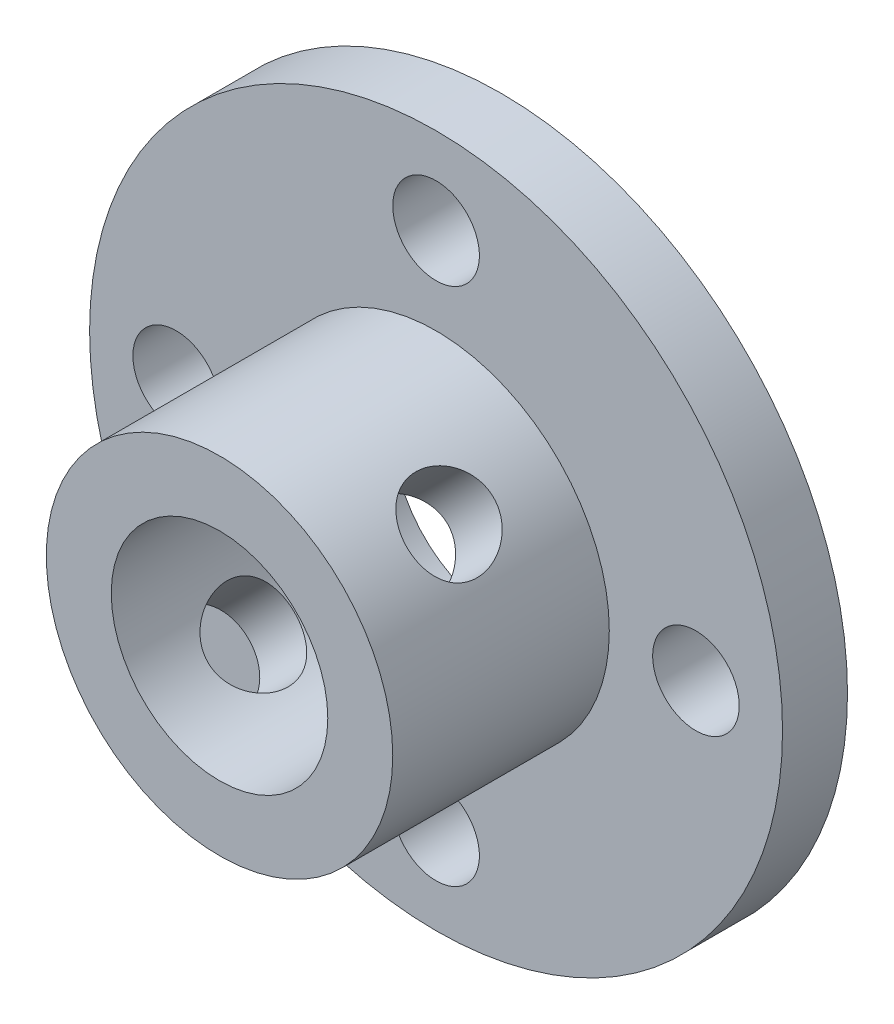
ISO-10303-21;
HEADER;
FILE_DESCRIPTION(('STEP AP214'),'2;1');
FILE_NAME('part.step','',(''),(''),'','','');
FILE_SCHEMA(('AUTOMOTIVE_DESIGN { 1 0 10303 214 1 1 1 1 }'));
ENDSEC;
DATA;
#1=APPLICATION_CONTEXT('core data for automotive mechanical design processes');
#2=APPLICATION_PROTOCOL_DEFINITION('international standard','automotive_design',2000,#1);
#3=PRODUCT_CONTEXT('',#1,'mechanical');
#4=PRODUCT('Part','Part','',(#3));
#5=PRODUCT_RELATED_PRODUCT_CATEGORY('part','',(#4));
#6=PRODUCT_DEFINITION_FORMATION('','',#4);
#7=PRODUCT_DEFINITION_CONTEXT('part definition',#1,'design');
#8=PRODUCT_DEFINITION('design','',#6,#7);
#9=PRODUCT_DEFINITION_SHAPE('','',#8);
#10=(LENGTH_UNIT() NAMED_UNIT(*) SI_UNIT(.MILLI.,.METRE.));
#11=(NAMED_UNIT(*) PLANE_ANGLE_UNIT() SI_UNIT($,.RADIAN.));
#12=(NAMED_UNIT(*) SI_UNIT($,.STERADIAN.) SOLID_ANGLE_UNIT());
#13=UNCERTAINTY_MEASURE_WITH_UNIT(LENGTH_MEASURE(1.E-05),#10,'distance_accuracy_value','');
#14=(GEOMETRIC_REPRESENTATION_CONTEXT(3) GLOBAL_UNCERTAINTY_ASSIGNED_CONTEXT((#13)) GLOBAL_UNIT_ASSIGNED_CONTEXT((#10,
#11,#12)) REPRESENTATION_CONTEXT('',''));
#15=CARTESIAN_POINT('',(0.,0.,0.));
#16=DIRECTION('',(0.,0.,1.));
#17=DIRECTION('',(1.,0.,0.));
#18=AXIS2_PLACEMENT_3D('',#15,#16,#17);
#19=CARTESIAN_POINT('',(0.,0.,10.));
#20=DIRECTION('',(0.,0.,-1.));
#21=DIRECTION('',(-1.,0.,0.));
#22=AXIS2_PLACEMENT_3D('',#19,#20,#21);
#23=CYLINDRICAL_SURFACE('',#22,8.);
#24=CARTESIAN_POINT('',(0.,0.,10.));
#25=DIRECTION('',(0.,0.,1.));
#26=DIRECTION('',(1.,0.,0.));
#27=AXIS2_PLACEMENT_3D('',#24,#25,#26);
#28=CIRCLE('',#27,8.);
#29=CARTESIAN_POINT('',(8.,0.,10.));
#30=VERTEX_POINT('',#29);
#31=EDGE_CURVE('E10',#30,#30,#28,.T.);
#32=ORIENTED_EDGE('',*,*,#31,.F.);
#33=EDGE_LOOP('',(#32));
#34=FACE_BOUND('',#33,.T.);
#35=CARTESIAN_POINT('',(0.,0.,0.));
#36=DIRECTION('',(0.,0.,1.));
#37=DIRECTION('',(1.,0.,0.));
#38=AXIS2_PLACEMENT_3D('',#35,#36,#37);
#39=CIRCLE('',#38,8.);
#40=CARTESIAN_POINT('',(8.,0.,0.));
#41=VERTEX_POINT('',#40);
#42=EDGE_CURVE('E51',#41,#41,#39,.T.);
#43=ORIENTED_EDGE('',*,*,#42,.T.);
#44=EDGE_LOOP('',(#43));
#45=FACE_BOUND('',#44,.T.);
#46=CARTESIAN_POINT('',(-4.06301201267858,-6.89143913742475,5.));
#47=CARTESIAN_POINT('',(-4.0630157217461,-6.89143840992678,5.11044060074126));
#48=CARTESIAN_POINT('',(-4.07119094661866,-6.88663699998199,5.22091591894282));
#49=CARTESIAN_POINT('',(-4.10347952386452,-6.8674446736421,5.43869406253881));
#50=CARTESIAN_POINT('',(-4.12760215209942,-6.85304817619185,5.54599500357455));
#51=CARTESIAN_POINT('',(-4.19053882294767,-6.81474355280739,5.75424283054975));
#52=CARTESIAN_POINT('',(-4.22933389862524,-6.79084770456586,5.85519772430857));
#53=CARTESIAN_POINT('',(-4.31983456089164,-6.73363818775688,6.04824868203191));
#54=CARTESIAN_POINT('',(-4.37154069559713,-6.70032411934725,6.14034436966417));
#55=CARTESIAN_POINT('',(-4.48684637018174,-6.62367602879998,6.31508931620977));
#56=CARTESIAN_POINT('',(-4.55066154225101,-6.58015630647196,6.39751488028004));
#57=CARTESIAN_POINT('',(-4.68695643232218,-6.48377932397724,6.54860911548827));
#58=CARTESIAN_POINT('',(-4.75943695936014,-6.4309211917146,6.6172765004974));
#59=CARTESIAN_POINT('',(-4.9114273459846,-6.31562284697669,6.73982037410502));
#60=CARTESIAN_POINT('',(-4.99102117674822,-6.25305922347522,6.79347711052917));
#61=CARTESIAN_POINT('',(-5.15341964034351,-6.11990810519378,6.88304771532247));
#62=CARTESIAN_POINT('',(-5.23622379749715,-6.0493217961739,6.91896420153241));
#63=CARTESIAN_POINT('',(-5.40042272750263,-5.90315727405414,6.97131826766287));
#64=CARTESIAN_POINT('',(-5.48181206953389,-5.82770915629177,6.98813571546127));
#65=CARTESIAN_POINT('',(-5.64220702569044,-5.67256036974151,7.00300670342044));
#66=CARTESIAN_POINT('',(-5.72121299050981,-5.59286033141329,7.00106301776768));
#67=CARTESIAN_POINT('',(-5.87281120401386,-5.43340869422118,6.97874011979989));
#68=CARTESIAN_POINT('',(-5.94550686942917,-5.35369748174385,6.95877093995692));
#69=CARTESIAN_POINT('',(-6.08465610567809,-5.19500759492307,6.9016229839612));
#70=CARTESIAN_POINT('',(-6.15110934400265,-5.1160289598028,6.86444329169807));
#71=CARTESIAN_POINT('',(-6.27706714233083,-4.96069819810759,6.77359794345035));
#72=CARTESIAN_POINT('',(-6.33650349248265,-4.88437625109203,6.7197863642706));
#73=CARTESIAN_POINT('',(-6.44688377889625,-4.7377342178455,6.59731545670699));
#74=CARTESIAN_POINT('',(-6.49782623493653,-4.66741517877447,6.5286535451515));
#75=CARTESIAN_POINT('',(-6.59197311379387,-4.53351729227357,6.3762330064141));
#76=CARTESIAN_POINT('',(-6.63493079405378,-4.47017237442468,6.29211608612178));
#77=CARTESIAN_POINT('',(-6.7110607284332,-4.3550477523866,6.1123200211678));
#78=CARTESIAN_POINT('',(-6.74423252520298,-4.30326858875801,6.0166403364072));
#79=CARTESIAN_POINT('',(-6.80076933823172,-4.21335778070836,5.81576797268083));
#80=CARTESIAN_POINT('',(-6.82408602244809,-4.17529352918692,5.71053141574944));
#81=CARTESIAN_POINT('',(-6.86057652149195,-4.11506298248301,5.49393162553884));
#82=CARTESIAN_POINT('',(-6.873752506853,-4.09289328527092,5.38256970881349));
#83=CARTESIAN_POINT('',(-6.88969956057794,-4.0659906610795,5.1600323987815));
#84=CARTESIAN_POINT('',(-6.89273625372944,-4.0608126568782,5.0489297653363));
#85=CARTESIAN_POINT('',(-6.88913796294824,-4.06691415530246,4.82734245073747));
#86=CARTESIAN_POINT('',(-6.88250386932815,-4.0781921429555,4.71685771363901));
#87=CARTESIAN_POINT('',(-6.85978220326759,-4.11629222019197,4.50150858803624));
#88=CARTESIAN_POINT('',(-6.84385108021401,-4.14285696526499,4.39658181874333));
#89=CARTESIAN_POINT('',(-6.80272093796124,-4.21005104125881,4.19325483371865));
#90=CARTESIAN_POINT('',(-6.77752082088313,-4.25068203824292,4.09485539275573));
#91=CARTESIAN_POINT('',(-6.71736283956605,-4.34513762694046,3.90524697770612));
#92=CARTESIAN_POINT('',(-6.68222325351208,-4.39920540384642,3.81421692796552));
#93=CARTESIAN_POINT('',(-6.60257934082749,-4.51785801571828,3.64384930975892));
#94=CARTESIAN_POINT('',(-6.55807347503847,-4.58244457883878,3.56451366667994));
#95=CARTESIAN_POINT('',(-6.45878734955348,-4.72139000779986,3.41775116594323));
#96=CARTESIAN_POINT('',(-6.40377787521787,-4.79595295356256,3.35067194996095));
#97=CARTESIAN_POINT('',(-6.28489454123505,-4.95071787868586,3.232851306439));
#98=CARTESIAN_POINT('',(-6.22102114420669,-5.03091956364613,3.18210902671344));
#99=CARTESIAN_POINT('',(-6.08598132443737,-5.193447947225,3.09884317237765));
#100=CARTESIAN_POINT('',(-6.0148718896184,-5.27575472095148,3.06618857249675));
#101=CARTESIAN_POINT('',(-5.86656929939353,-5.44018458825881,3.01963173231327));
#102=CARTESIAN_POINT('',(-5.78937732112478,-5.5223077142323,3.00572587300877));
#103=CARTESIAN_POINT('',(-5.6331777231166,-5.68149723269519,2.99726482084892));
#104=CARTESIAN_POINT('',(-5.55427562898415,-5.75864031304154,3.00219658180918));
#105=CARTESIAN_POINT('',(-5.39507125325284,-5.90805599965961,3.0300956545887));
#106=CARTESIAN_POINT('',(-5.31476901336534,-5.98032875071098,3.05306243002634));
#107=CARTESIAN_POINT('',(-5.15577475692787,-6.11792374119854,3.11610443954172));
#108=CARTESIAN_POINT('',(-5.07707639915272,-6.18328130338112,3.15608690662876));
#109=CARTESIAN_POINT('',(-4.92343720739472,-6.3063034619686,3.25194115803914));
#110=CARTESIAN_POINT('',(-4.84849684848019,-6.36396708726517,3.30781494534097));
#111=CARTESIAN_POINT('',(-4.70320842178744,-6.47211220000846,3.43543046799227));
#112=CARTESIAN_POINT('',(-4.63301338394892,-6.52238852804643,3.50752028580766));
#113=CARTESIAN_POINT('',(-4.50185397028259,-6.61360014536707,3.66484570395469));
#114=CARTESIAN_POINT('',(-4.44089193901819,-6.65453306338498,3.75008463222233));
#115=CARTESIAN_POINT('',(-4.32963282694855,-6.72746593795126,3.93320282837892));
#116=CARTESIAN_POINT('',(-4.27955592822717,-6.75928499530021,4.03128824673051));
#117=CARTESIAN_POINT('',(-4.19386822084579,-6.81278497068017,4.23611097974964));
#118=CARTESIAN_POINT('',(-4.1582468883215,-6.83447326579849,4.34284193218769));
#119=CARTESIAN_POINT('',(-4.10842695365123,-6.86451006442521,4.54115402367032));
#120=CARTESIAN_POINT('',(-4.09145200755028,-6.87460498183148,4.63178632877227));
#121=CARTESIAN_POINT('',(-4.06874346251733,-6.888069536294,4.81493773799538));
#122=CARTESIAN_POINT('',(-4.06300890467828,-6.89143974702916,4.9074566804888));
#123=CARTESIAN_POINT('',(-4.06301201267858,-6.89143913742475,5.));
#124=B_SPLINE_CURVE_WITH_KNOTS('',3,(#46,#47,#48,#49,#50,#51,#52,#53,#54,#55,#56,#57,#58,#59,
#60,#61,#62,#63,#64,#65,#66,#67,#68,#69,#70,#71,#72,#73,#74,#75,#76,#77,#78,#79,#80,#81,#82,#83,
#84,#85,#86,#87,#88,#89,#90,#91,#92,#93,#94,#95,#96,#97,#98,#99,#100,#101,#102,#103,#104,#105,
#106,#107,#108,#109,#110,#111,#112,#113,#114,#115,#116,#117,#118,#119,#120,#121,#122,#123),
.UNSPECIFIED.,.T.,.F.,(4,2,2,2,2,2,2,2,2,2,2,2,2,2,2,2,2,2,2,2,2,2,2,2,2,2,2,2,2,2,2,2,2,2,2,2,
2,2,4),(0.,0.33098195338891,0.662156593142933,0.992904581732815,1.32366661404383,
1.66099163354381,1.99834817183893,2.34041197118336,2.68242527877674,3.01751000796277,
3.35254518932816,3.68014610151158,4.00776445379829,4.33834299403556,4.66897908375131,
5.00856373257529,5.34816424959842,5.68941145606722,6.03058560103638,6.36274859809374,
6.69488101747041,7.02157924007365,7.34831617137134,7.68146276687326,8.01466415108036,
8.35620264772255,8.69772332575642,9.03673658245543,9.37568439127231,9.70546756901965,
10.0352409390158,10.3632390124777,10.6912784459046,11.0271767726566,11.3631602525241,
11.7054118182895,12.0474137709606,12.3247826174462,12.6021278008238),.UNSPECIFIED.);
#125=CARTESIAN_POINT('',(-4.06301201267858,-6.89143913742475,5.));
#126=VERTEX_POINT('',#125);
#127=EDGE_CURVE('E78',#126,#126,#124,.T.);
#128=ORIENTED_EDGE('',*,*,#127,.F.);
#129=EDGE_LOOP('',(#128));
#130=FACE_BOUND('',#129,.T.);
#131=CARTESIAN_POINT('',(6.89143913742476,4.06301201267855,5.));
#132=CARTESIAN_POINT('',(6.89143840992679,4.06301572174607,4.88955939925874));
#133=CARTESIAN_POINT('',(6.886636999982,4.07119094661864,4.77908408105718));
#134=CARTESIAN_POINT('',(6.86744467364212,4.1034795238645,4.56130593746119));
#135=CARTESIAN_POINT('',(6.85304817619186,4.12760215209939,4.45400499642545));
#136=CARTESIAN_POINT('',(6.81474355280741,4.19053882294765,4.24575716945025));
#137=CARTESIAN_POINT('',(6.79084770456588,4.22933389862521,4.14480227569143));
#138=CARTESIAN_POINT('',(6.73363818775689,4.31983456089162,3.95175131796809));
#139=CARTESIAN_POINT('',(6.70032411934727,4.37154069559711,3.85965563033583));
#140=CARTESIAN_POINT('',(6.62367602879999,4.48684637018172,3.68491068379023));
#141=CARTESIAN_POINT('',(6.58015630647198,4.55066154225099,3.60248511971996));
#142=CARTESIAN_POINT('',(6.48377932397725,4.68695643232215,3.45139088451173));
#143=CARTESIAN_POINT('',(6.43092119171462,4.75943695936012,3.3827234995026));
#144=CARTESIAN_POINT('',(6.31562284697671,4.91142734598458,3.26017962589498));
#145=CARTESIAN_POINT('',(6.25305922347523,4.9910211767482,3.20652288947083));
#146=CARTESIAN_POINT('',(6.11990810519379,5.15341964034349,3.11695228467753));
#147=CARTESIAN_POINT('',(6.04932179617391,5.23622379749713,3.08103579846759));
#148=CARTESIAN_POINT('',(5.90315727405416,5.40042272750262,3.02868173233713));
#149=CARTESIAN_POINT('',(5.82770915629178,5.48181206953387,3.01186428453873));
#150=CARTESIAN_POINT('',(5.67256036974153,5.64220702569042,2.99699329657956));
#151=CARTESIAN_POINT('',(5.59286033141331,5.72121299050979,2.99893698223232));
#152=CARTESIAN_POINT('',(5.4334086942212,5.87281120401384,3.02125988020011));
#153=CARTESIAN_POINT('',(5.35369748174387,5.94550686942915,3.04122906004308));
#154=CARTESIAN_POINT('',(5.19500759492309,6.08465610567807,3.0983770160388));
#155=CARTESIAN_POINT('',(5.11602895980282,6.15110934400263,3.13555670830193));
#156=CARTESIAN_POINT('',(4.96069819810762,6.27706714233082,3.22640205654965));
#157=CARTESIAN_POINT('',(4.88437625109205,6.33650349248264,3.2802136357294));
#158=CARTESIAN_POINT('',(4.73773421784553,6.44688377889623,3.40268454329301));
#159=CARTESIAN_POINT('',(4.66741517877449,6.49782623493651,3.4713464548485));
#160=CARTESIAN_POINT('',(4.53351729227359,6.59197311379385,3.6237669935859));
#161=CARTESIAN_POINT('',(4.47017237442471,6.63493079405377,3.70788391387822));
#162=CARTESIAN_POINT('',(4.35504775238662,6.71106072843319,3.8876799788322));
#163=CARTESIAN_POINT('',(4.30326858875804,6.74423252520297,3.9833596635928));
#164=CARTESIAN_POINT('',(4.21335778070839,6.8007693382317,4.18423202731917));
#165=CARTESIAN_POINT('',(4.17529352918694,6.82408602244807,4.28946858425056));
#166=CARTESIAN_POINT('',(4.11506298248304,6.86057652149194,4.50606837446116));
#167=CARTESIAN_POINT('',(4.09289328527094,6.87375250685299,4.61743029118651));
#168=CARTESIAN_POINT('',(4.06599066107952,6.88969956057793,4.8399676012185));
#169=CARTESIAN_POINT('',(4.06081265687822,6.89273625372943,4.9510702346637));
#170=CARTESIAN_POINT('',(4.06691415530249,6.88913796294823,5.17265754926253));
#171=CARTESIAN_POINT('',(4.07819214295553,6.88250386932814,5.28314228636099));
#172=CARTESIAN_POINT('',(4.11629222019199,6.85978220326758,5.49849141196377));
#173=CARTESIAN_POINT('',(4.14285696526501,6.84385108021399,5.60341818125668));
#174=CARTESIAN_POINT('',(4.21005104125884,6.80272093796122,5.80674516628135));
#175=CARTESIAN_POINT('',(4.25068203824295,6.77752082088311,5.90514460724427));
#176=CARTESIAN_POINT('',(4.34513762694048,6.71736283956604,6.09475302229388));
#177=CARTESIAN_POINT('',(4.39920540384644,6.68222325351206,6.18578307203448));
#178=CARTESIAN_POINT('',(4.51785801571831,6.60257934082748,6.35615069024108));
#179=CARTESIAN_POINT('',(4.5824445788388,6.55807347503845,6.43548633332006));
#180=CARTESIAN_POINT('',(4.72139000779989,6.45878734955347,6.58224883405676));
#181=CARTESIAN_POINT('',(4.79595295356259,6.40377787521786,6.64932805003905));
#182=CARTESIAN_POINT('',(4.95071787868589,6.28489454123503,6.767148693561));
#183=CARTESIAN_POINT('',(5.03091956364615,6.22102114420667,6.81789097328657));
#184=CARTESIAN_POINT('',(5.19344794722502,6.08598132443735,6.90115682762235));
#185=CARTESIAN_POINT('',(5.2757547209515,6.01487188961838,6.93381142750325));
#186=CARTESIAN_POINT('',(5.44018458825883,5.86656929939352,6.98036826768673));
#187=CARTESIAN_POINT('',(5.52230771423232,5.78937732112476,6.99427412699123));
#188=CARTESIAN_POINT('',(5.68149723269521,5.63317772311658,7.00273517915108));
#189=CARTESIAN_POINT('',(5.75864031304156,5.55427562898413,6.99780341819082));
#190=CARTESIAN_POINT('',(5.90805599965963,5.39507125325282,6.9699043454113));
#191=CARTESIAN_POINT('',(5.980328750711,5.31476901336532,6.94693756997366));
#192=CARTESIAN_POINT('',(6.11792374119856,5.15577475692785,6.88389556045828));
#193=CARTESIAN_POINT('',(6.18328130338113,5.0770763991527,6.84391309337124));
#194=CARTESIAN_POINT('',(6.30630346196862,4.92343720739469,6.74805884196086));
#195=CARTESIAN_POINT('',(6.36396708726519,4.84849684848017,6.69218505465903));
#196=CARTESIAN_POINT('',(6.47211220000848,4.70320842178741,6.56456953200774));
#197=CARTESIAN_POINT('',(6.52238852804645,4.6330133839489,6.49247971419234));
#198=CARTESIAN_POINT('',(6.61360014536709,4.50185397028257,6.33515429604531));
#199=CARTESIAN_POINT('',(6.65453306338499,4.44089193901817,6.24991536777767));
#200=CARTESIAN_POINT('',(6.72746593795127,4.32963282694853,6.06679717162108));
#201=CARTESIAN_POINT('',(6.75928499530023,4.27955592822714,5.96871175326949));
#202=CARTESIAN_POINT('',(6.81278497068019,4.19386822084576,5.76388902025036));
#203=CARTESIAN_POINT('',(6.83447326579851,4.15824688832148,5.65715806781231));
#204=CARTESIAN_POINT('',(6.86451006442523,4.10842695365121,5.45884597632968));
#205=CARTESIAN_POINT('',(6.87460498183149,4.09145200755026,5.36821367122773));
#206=CARTESIAN_POINT('',(6.88806953629401,4.06874346251731,5.18506226200462));
#207=CARTESIAN_POINT('',(6.89143974702917,4.06300890467825,5.0925433195112));
#208=CARTESIAN_POINT('',(6.89143913742476,4.06301201267855,5.));
#209=B_SPLINE_CURVE_WITH_KNOTS('',3,(#131,#132,#133,#134,#135,#136,#137,#138,#139,#140,#141,
#142,#143,#144,#145,#146,#147,#148,#149,#150,#151,#152,#153,#154,#155,#156,#157,#158,#159,#160,
#161,#162,#163,#164,#165,#166,#167,#168,#169,#170,#171,#172,#173,#174,#175,#176,#177,#178,#179,
#180,#181,#182,#183,#184,#185,#186,#187,#188,#189,#190,#191,#192,#193,#194,#195,#196,#197,#198,
#199,#200,#201,#202,#203,#204,#205,#206,#207,#208),.UNSPECIFIED.,.T.,.F.,(4,2,2,2,2,2,2,2,2,2,2,
2,2,2,2,2,2,2,2,2,2,2,2,2,2,2,2,2,2,2,2,2,2,2,2,2,2,2,4),(0.,0.33098195338891,0.662156593142934,
0.992904581732817,1.32366661404383,1.66099163354381,1.99834817183893,2.34041197118336,
2.68242527877674,3.01751000796277,3.35254518932817,3.68014610151158,4.00776445379829,
4.33834299403556,4.66897908375131,5.00856373257529,5.34816424959842,5.68941145606722,
6.03058560103638,6.36274859809374,6.69488101747042,7.02157924007366,7.34831617137134,
7.68146276687326,8.01466415108036,8.35620264772255,8.69772332575643,9.03673658245543,
9.37568439127231,9.70546756901965,10.0352409390158,10.3632390124777,10.6912784459046,
11.0271767726566,11.3631602525241,11.7054118182895,12.0474137709606,12.3247826174462,
12.6021278008238),.UNSPECIFIED.);
#210=CARTESIAN_POINT('',(6.89143913742476,4.06301201267855,5.));
#211=VERTEX_POINT('',#210);
#212=EDGE_CURVE('E83',#211,#211,#209,.T.);
#213=ORIENTED_EDGE('',*,*,#212,.F.);
#214=EDGE_LOOP('',(#213));
#215=FACE_BOUND('',#214,.T.);
#216=ADVANCED_FACE('F33',(#34,#45,#130,#215),#23,.T.);
#217=CARTESIAN_POINT('',(0.,0.,10.));
#218=DIRECTION('',(0.,0.,-1.));
#219=DIRECTION('',(-1.,0.,0.));
#220=AXIS2_PLACEMENT_3D('',#217,#218,#219);
#221=CYLINDRICAL_SURFACE('',#220,5.);
#222=CARTESIAN_POINT('',(-1.82615678683084,-4.65458391157702,5.));
#223=CARTESIAN_POINT('',(-1.82616324424403,-4.6545838645698,5.10712368971296));
#224=CARTESIAN_POINT('',(-1.83497222165131,-4.65115471136315,5.21442629433184));
#225=CARTESIAN_POINT('',(-1.86962124721883,-4.63733209488487,5.42593908409957));
#226=CARTESIAN_POINT('',(-1.8955048143237,-4.62692083480429,5.53014065433852));
#227=CARTESIAN_POINT('',(-1.96248193078627,-4.59890912164689,5.73205180897083));
#228=CARTESIAN_POINT('',(-2.00351815879123,-4.58133573667783,5.82978424329122));
#229=CARTESIAN_POINT('',(-2.09849963181465,-4.53861218319791,6.0168853548623));
#230=CARTESIAN_POINT('',(-2.15244205798812,-4.51346366886222,6.10625585252411));
#231=CARTESIAN_POINT('',(-2.27383380201418,-4.45359229852604,6.27926031454433));
#232=CARTESIAN_POINT('',(-2.34183852423474,-4.41844054168607,6.36235639939725));
#233=CARTESIAN_POINT('',(-2.48648123422036,-4.33868959931964,6.5155290208558));
#234=CARTESIAN_POINT('',(-2.56312222396002,-4.29408712394244,6.58560100770971));
#235=CARTESIAN_POINT('',(-2.72520916612746,-4.19317177232848,6.71340639030971));
#236=CARTESIAN_POINT('',(-2.81088314768819,-4.13646648440322,6.77054429968594));
#237=CARTESIAN_POINT('',(-2.98484901238905,-4.0127352403347,6.86684357017379));
#238=CARTESIAN_POINT('',(-3.07313981465626,-3.94571349870653,6.90601224624887));
#239=CARTESIAN_POINT('',(-3.24450065035923,-3.80589595528562,6.96334148599309));
#240=CARTESIAN_POINT('',(-3.32761649870704,-3.73353678188784,6.98242731397022));
#241=CARTESIAN_POINT('',(-3.48995152472471,-3.58225205177444,7.00202848578145));
#242=CARTESIAN_POINT('',(-3.56917214474665,-3.50332895517733,7.0025507559658));
#243=CARTESIAN_POINT('',(-3.71687294109083,-3.34602019058819,6.9855172301958));
#244=CARTESIAN_POINT('',(-3.78570646119493,-3.26785334111028,6.96897522724529));
#245=CARTESIAN_POINT('',(-3.91607475084606,-3.11043531366516,6.92000712369703));
#246=CARTESIAN_POINT('',(-3.97760898443473,-3.03118405655004,6.88757985760154));
#247=CARTESIAN_POINT('',(-4.09334653344106,-2.87302456585563,6.80736351712174));
#248=CARTESIAN_POINT('',(-4.14742538474805,-2.79413950369177,6.75935028518462));
#249=CARTESIAN_POINT('',(-4.2468508026934,-2.64057551166111,6.64953499308084));
#250=CARTESIAN_POINT('',(-4.29219436646024,-2.56589803442728,6.58772820689983));
#251=CARTESIAN_POINT('',(-4.37698051018859,-2.41862165289337,6.44735086405612));
#252=CARTESIAN_POINT('',(-4.41584020726311,-2.34648111723864,6.3679461074272));
#253=CARTESIAN_POINT('',(-4.48427606257974,-2.21289717310344,6.197009428168));
#254=CARTESIAN_POINT('',(-4.51384918353912,-2.15145726730845,6.1054735518044));
#255=CARTESIAN_POINT('',(-4.56499169190285,-2.0407559806795,5.90958097762606));
#256=CARTESIAN_POINT('',(-4.58631140641134,-1.99188762142393,5.80493516966135));
#257=CARTESIAN_POINT('',(-4.62027259330123,-1.91180435226309,5.58778450968778));
#258=CARTESIAN_POINT('',(-4.63291970294553,-1.88057797725566,5.47528481527341));
#259=CARTESIAN_POINT('',(-4.64940566320732,-1.83942702671237,5.25296422253256));
#260=CARTESIAN_POINT('',(-4.65373543040569,-1.82831761520378,5.14339955287144));
#261=CARTESIAN_POINT('',(-4.65520659700507,-1.82457142322805,4.92392279224044));
#262=CARTESIAN_POINT('',(-4.65235017627355,-1.83192904094696,4.81401081672435));
#263=CARTESIAN_POINT('',(-4.6397471449578,-1.86359940176121,4.60354106504306));
#264=CARTESIAN_POINT('',(-4.63040223501923,-1.8869225886091,4.50280706259994));
#265=CARTESIAN_POINT('',(-4.60503623388824,-1.94800587171552,4.30671159521455));
#266=CARTESIAN_POINT('',(-4.58901366233406,-1.98576916902938,4.21135132689285));
#267=CARTESIAN_POINT('',(-4.54915270879387,-2.07550136500888,4.02439764220434));
#268=CARTESIAN_POINT('',(-4.52502371983911,-2.12798424382044,3.93311381130546));
#269=CARTESIAN_POINT('',(-4.46868085850851,-2.24388926224916,3.76051701255841));
#270=CARTESIAN_POINT('',(-4.4364636921698,-2.30731585546603,3.67920812720455));
#271=CARTESIAN_POINT('',(-4.36076525885259,-2.44755462691596,3.52262659140063));
#272=CARTESIAN_POINT('',(-4.31662774613334,-2.52500947410998,3.4482434347084));
#273=CARTESIAN_POINT('',(-4.21809105622909,-2.68637949273501,3.31482292339023));
#274=CARTESIAN_POINT('',(-4.16369146150539,-2.77029492694906,3.25578619340488));
#275=CARTESIAN_POINT('',(-4.04473358564627,-2.94125112053162,3.15495237353666));
#276=CARTESIAN_POINT('',(-3.9801777420095,-3.02829112614464,3.11315115582634));
#277=CARTESIAN_POINT('',(-3.84179650807948,-3.20201535627745,3.04845114760024));
#278=CARTESIAN_POINT('',(-3.76797617355337,-3.28869974841693,3.02554209858931));
#279=CARTESIAN_POINT('',(-3.61798721820726,-3.45278372494334,3.00049529834715));
#280=CARTESIAN_POINT('',(-3.54228604040776,-3.53042009190418,2.99709987143797));
#281=CARTESIAN_POINT('',(-3.38663601833103,-3.67999176220351,3.00785547938347));
#282=CARTESIAN_POINT('',(-3.30668781879469,-3.75192792678246,3.02200385815558));
#283=CARTESIAN_POINT('',(-3.14771711325914,-3.88617828436709,3.06654678799988));
#284=CARTESIAN_POINT('',(-3.06874160918292,-3.94872016464341,3.09642894475655));
#285=CARTESIAN_POINT('',(-2.91188490316894,-4.06577336422069,3.17105280588107));
#286=CARTESIAN_POINT('',(-2.83400390582743,-4.12028319968865,3.21579725093909));
#287=CARTESIAN_POINT('',(-2.67850486524622,-4.22311321558957,3.32110319335323));
#288=CARTESIAN_POINT('',(-2.60105052698836,-4.27105342698295,3.38227627532514));
#289=CARTESIAN_POINT('',(-2.45284027421011,-4.35786236703678,3.51778853874699));
#290=CARTESIAN_POINT('',(-2.38208715082061,-4.3967273255434,3.59213316960822));
#291=CARTESIAN_POINT('',(-2.24589590938627,-4.4679099824347,3.75731514684866));
#292=CARTESIAN_POINT('',(-2.18105797053548,-4.49967342388554,3.8488885751441));
#293=CARTESIAN_POINT('',(-2.06521067155873,-4.5540110542653,4.04294243572083));
#294=CARTESIAN_POINT('',(-2.01420293736748,-4.57658416289792,4.14542414845355));
#295=CARTESIAN_POINT('',(-1.93294614802537,-4.61145317823395,4.3490361864702));
#296=CARTESIAN_POINT('',(-1.9012443959593,-4.62448989138703,4.44946160271244));
#297=CARTESIAN_POINT('',(-1.85384896652876,-4.64369621700287,4.65448904149264));
#298=CARTESIAN_POINT('',(-1.83811068579082,-4.64988496771719,4.75907857342436));
#299=CARTESIAN_POINT('',(-1.82928214408065,-4.65335635038966,4.88677823911152));
#300=CARTESIAN_POINT('',(-1.82811144825653,-4.65381664679261,4.90940148035643));
#301=CARTESIAN_POINT('',(-1.82654805802468,-4.65443044360593,4.95468047679722));
#302=CARTESIAN_POINT('',(-1.82615542065964,-4.65458392152217,4.97733623425516));
#303=CARTESIAN_POINT('',(-1.82615678683084,-4.65458391157702,5.));
#304=B_SPLINE_CURVE_WITH_KNOTS('',3,(#222,#223,#224,#225,#226,#227,#228,#229,#230,#231,#232,
#233,#234,#235,#236,#237,#238,#239,#240,#241,#242,#243,#244,#245,#246,#247,#248,#249,#250,#251,
#252,#253,#254,#255,#256,#257,#258,#259,#260,#261,#262,#263,#264,#265,#266,#267,#268,#269,#270,
#271,#272,#273,#274,#275,#276,#277,#278,#279,#280,#281,#282,#283,#284,#285,#286,#287,#288,#289,
#290,#291,#292,#293,#294,#295,#296,#297,#298,#299,#300,#301,#302,#303),.UNSPECIFIED.,.T.,.F.,(4,
2,2,2,2,2,2,2,2,2,2,2,2,2,2,2,2,2,2,2,2,2,2,2,2,2,2,2,2,2,2,2,2,2,2,2,2,2,2,2,4),(0.,
0.321277648767655,0.643377335822246,0.964270823293391,1.28509428823862,1.62255618284425,
1.96013574348342,2.31102669091428,2.6617746696948,2.99554182887184,3.32918445305672,
3.64408644830303,3.9590115512906,4.27868300234898,4.59846414940031,4.93924044081356,
5.28012807127127,5.63064458717258,5.98093304800102,6.30982147524421,6.6386101490794,
6.94867248085145,7.25880358651638,7.58151154652701,7.9043511452585,8.2510373424698,
8.59773764852748,8.94435487312813,9.29078375954136,9.61461039755953,9.93838801512602,
10.2522199444335,10.5661097782859,10.8938705113993,11.2217671656421,11.5699625328561,
11.9181988175919,12.2351666081908,12.5512463021924,12.619212852096,12.6871843847255),.UNSPECIFIED.);
#305=CARTESIAN_POINT('',(-1.82615678683084,-4.65458391157702,5.));
#306=VERTEX_POINT('',#305);
#307=EDGE_CURVE('E57',#306,#306,#304,.T.);
#308=ORIENTED_EDGE('',*,*,#307,.T.);
#309=EDGE_LOOP('',(#308));
#310=FACE_BOUND('',#309,.T.);
#311=CARTESIAN_POINT('',(0.,0.,10.));
#312=DIRECTION('',(0.,0.,1.));
#313=DIRECTION('',(1.,0.,0.));
#314=AXIS2_PLACEMENT_3D('',#311,#312,#313);
#315=CIRCLE('',#314,5.);
#316=CARTESIAN_POINT('',(5.,0.,10.));
#317=VERTEX_POINT('',#316);
#318=EDGE_CURVE('E46',#317,#317,#315,.T.);
#319=ORIENTED_EDGE('',*,*,#318,.T.);
#320=EDGE_LOOP('',(#319));
#321=FACE_BOUND('',#320,.T.);
#322=CARTESIAN_POINT('',(0.,0.,-3.));
#323=DIRECTION('',(0.,0.,-1.));
#324=DIRECTION('',(-1.,0.,0.));
#325=AXIS2_PLACEMENT_3D('',#322,#323,#324);
#326=CIRCLE('',#325,5.);
#327=CARTESIAN_POINT('',(-5.,0.,-3.));
#328=VERTEX_POINT('',#327);
#329=EDGE_CURVE('E111',#328,#328,#326,.T.);
#330=ORIENTED_EDGE('',*,*,#329,.T.);
#331=EDGE_LOOP('',(#330));
#332=FACE_BOUND('',#331,.T.);
#333=CARTESIAN_POINT('',(4.65458391157703,1.82615678683083,5.));
#334=CARTESIAN_POINT('',(4.6545838645698,1.82616324424401,4.89287631028704));
#335=CARTESIAN_POINT('',(4.65115471136316,1.83497222165129,4.78557370566816));
#336=CARTESIAN_POINT('',(4.63733209488488,1.86962124721882,4.57406091590043));
#337=CARTESIAN_POINT('',(4.6269208348043,1.89550481432369,4.46985934566148));
#338=CARTESIAN_POINT('',(4.5989091216469,1.96248193078625,4.26794819102917));
#339=CARTESIAN_POINT('',(4.58133573667784,2.00351815879121,4.17021575670878));
#340=CARTESIAN_POINT('',(4.53861218319792,2.09849963181463,3.9831146451377));
#341=CARTESIAN_POINT('',(4.51346366886222,2.15244205798811,3.89374414747589));
#342=CARTESIAN_POINT('',(4.45359229852605,2.27383380201416,3.72073968545567));
#343=CARTESIAN_POINT('',(4.41844054168608,2.34183852423472,3.63764360060276));
#344=CARTESIAN_POINT('',(4.33868959931965,2.48648123422035,3.4844709791442));
#345=CARTESIAN_POINT('',(4.29408712394245,2.56312222396001,3.4143989922903));
#346=CARTESIAN_POINT('',(4.19317177232849,2.72520916612745,3.28659360969029));
#347=CARTESIAN_POINT('',(4.13646648440323,2.81088314768818,3.22945570031406));
#348=CARTESIAN_POINT('',(4.01273524033471,2.98484901238903,3.13315642982621));
#349=CARTESIAN_POINT('',(3.94571349870654,3.07313981465624,3.09398775375113));
#350=CARTESIAN_POINT('',(3.80589595528563,3.24450065035921,3.03665851400691));
#351=CARTESIAN_POINT('',(3.73353678188785,3.32761649870703,3.01757268602978));
#352=CARTESIAN_POINT('',(3.58225205177445,3.4899515247247,2.99797151421855));
#353=CARTESIAN_POINT('',(3.50332895517734,3.56917214474664,2.9974492440342));
#354=CARTESIAN_POINT('',(3.3460201905882,3.71687294109081,3.0144827698042));
#355=CARTESIAN_POINT('',(3.26785334111029,3.78570646119491,3.03102477275472));
#356=CARTESIAN_POINT('',(3.11043531366518,3.91607475084605,3.07999287630297));
#357=CARTESIAN_POINT('',(3.03118405655006,3.97760898443472,3.11242014239846));
#358=CARTESIAN_POINT('',(2.87302456585564,4.09334653344105,3.19263648287826));
#359=CARTESIAN_POINT('',(2.79413950369178,4.14742538474803,3.24064971481538));
#360=CARTESIAN_POINT('',(2.64057551166113,4.24685080269339,3.35046500691916));
#361=CARTESIAN_POINT('',(2.56589803442729,4.29219436646023,3.41227179310017));
#362=CARTESIAN_POINT('',(2.41862165289339,4.37698051018858,3.55264913594388));
#363=CARTESIAN_POINT('',(2.34648111723865,4.4158402072631,3.6320538925728));
#364=CARTESIAN_POINT('',(2.21289717310346,4.48427606257973,3.802990571832));
#365=CARTESIAN_POINT('',(2.15145726730847,4.51384918353912,3.89452644819561));
#366=CARTESIAN_POINT('',(2.04075598067951,4.56499169190284,4.09041902237394));
#367=CARTESIAN_POINT('',(1.99188762142394,4.58631140641134,4.19506483033865));
#368=CARTESIAN_POINT('',(1.91180435226311,4.62027259330122,4.41221549031222));
#369=CARTESIAN_POINT('',(1.88057797725567,4.63291970294552,4.52471518472659));
#370=CARTESIAN_POINT('',(1.83942702671239,4.64940566320731,4.74703577746744));
#371=CARTESIAN_POINT('',(1.8283176152038,4.65373543040569,4.85660044712856));
#372=CARTESIAN_POINT('',(1.82457142322806,4.65520659700507,5.07607720775956));
#373=CARTESIAN_POINT('',(1.83192904094697,4.65235017627354,5.18598918327565));
#374=CARTESIAN_POINT('',(1.86359940176123,4.6397471449578,5.39645893495694));
#375=CARTESIAN_POINT('',(1.88692258860912,4.63040223501922,5.49719293740006));
#376=CARTESIAN_POINT('',(1.94800587171554,4.60503623388824,5.69328840478545));
#377=CARTESIAN_POINT('',(1.98576916902939,4.58901366233406,5.78864867310715));
#378=CARTESIAN_POINT('',(2.07550136500889,4.54915270879386,5.97560235779566));
#379=CARTESIAN_POINT('',(2.12798424382045,4.52502371983911,6.06688618869453));
#380=CARTESIAN_POINT('',(2.24388926224917,4.4686808585085,6.23948298744159));
#381=CARTESIAN_POINT('',(2.30731585546605,4.43646369216979,6.32079187279545));
#382=CARTESIAN_POINT('',(2.44755462691598,4.36076525885258,6.47737340859937));
#383=CARTESIAN_POINT('',(2.52500947410999,4.31662774613333,6.5517565652916));
#384=CARTESIAN_POINT('',(2.68637949273502,4.21809105622908,6.68517707660977));
#385=CARTESIAN_POINT('',(2.77029492694907,4.16369146150538,6.74421380659512));
#386=CARTESIAN_POINT('',(2.94125112053163,4.04473358564626,6.84504762646334));
#387=CARTESIAN_POINT('',(3.02829112614466,3.98017774200949,6.88684884417366));
#388=CARTESIAN_POINT('',(3.20201535627746,3.84179650807947,6.95154885239976));
#389=CARTESIAN_POINT('',(3.28869974841694,3.76797617355336,6.97445790141069));
#390=CARTESIAN_POINT('',(3.45278372494335,3.61798721820724,6.99950470165285));
#391=CARTESIAN_POINT('',(3.53042009190419,3.54228604040775,7.00290012856203));
#392=CARTESIAN_POINT('',(3.67999176220352,3.38663601833101,6.99214452061653));
#393=CARTESIAN_POINT('',(3.75192792678247,3.30668781879468,6.97799614184442));
#394=CARTESIAN_POINT('',(3.8861782843671,3.14771711325913,6.93345321200012));
#395=CARTESIAN_POINT('',(3.94872016464342,3.0687416091829,6.90357105524345));
#396=CARTESIAN_POINT('',(4.0657733642207,2.91188490316893,6.82894719411893));
#397=CARTESIAN_POINT('',(4.12028319968866,2.83400390582742,6.78420274906091));
#398=CARTESIAN_POINT('',(4.22311321558957,2.67850486524621,6.67889680664677));
#399=CARTESIAN_POINT('',(4.27105342698296,2.60105052698835,6.61772372467486));
#400=CARTESIAN_POINT('',(4.35786236703678,2.45284027421009,6.48221146125301));
#401=CARTESIAN_POINT('',(4.39672732554341,2.38208715082059,6.40786683039178));
#402=CARTESIAN_POINT('',(4.4679099824347,2.24589590938625,6.24268485315134));
#403=CARTESIAN_POINT('',(4.49967342388554,2.18105797053547,6.1511114248559));
#404=CARTESIAN_POINT('',(4.55401105426531,2.06521067155872,5.95705756427917));
#405=CARTESIAN_POINT('',(4.57658416289792,2.01420293736747,5.85457585154645));
#406=CARTESIAN_POINT('',(4.61145317823396,1.93294614802535,5.6509638135298));
#407=CARTESIAN_POINT('',(4.62448989138703,1.90124439595929,5.55053839728756));
#408=CARTESIAN_POINT('',(4.64369621700287,1.85384896652874,5.34551095850736));
#409=CARTESIAN_POINT('',(4.64988496771719,1.8381106857908,5.24092142657565));
#410=CARTESIAN_POINT('',(4.65335635038967,1.82928214408063,5.11322176088848));
#411=CARTESIAN_POINT('',(4.65381664679261,1.82811144825651,5.09059851964357));
#412=CARTESIAN_POINT('',(4.65443044360593,1.82654805802466,5.04531952320278));
#413=CARTESIAN_POINT('',(4.65458392152217,1.82615542065963,5.02266376574484));
#414=CARTESIAN_POINT('',(4.65458391157703,1.82615678683083,5.));
#415=B_SPLINE_CURVE_WITH_KNOTS('',3,(#333,#334,#335,#336,#337,#338,#339,#340,#341,#342,#343,
#344,#345,#346,#347,#348,#349,#350,#351,#352,#353,#354,#355,#356,#357,#358,#359,#360,#361,#362,
#363,#364,#365,#366,#367,#368,#369,#370,#371,#372,#373,#374,#375,#376,#377,#378,#379,#380,#381,
#382,#383,#384,#385,#386,#387,#388,#389,#390,#391,#392,#393,#394,#395,#396,#397,#398,#399,#400,
#401,#402,#403,#404,#405,#406,#407,#408,#409,#410,#411,#412,#413,#414),.UNSPECIFIED.,.T.,.F.,(4,
2,2,2,2,2,2,2,2,2,2,2,2,2,2,2,2,2,2,2,2,2,2,2,2,2,2,2,2,2,2,2,2,2,2,2,2,2,2,2,4),(0.,
0.321277648767654,0.643377335822246,0.964270823293392,1.28509428823861,1.62255618284425,
1.96013574348342,2.31102669091428,2.6617746696948,2.99554182887184,3.32918445305672,
3.64408644830302,3.95901155129059,4.27868300234898,4.59846414940031,4.93924044081356,
5.28012807127127,5.63064458717257,5.98093304800101,6.30982147524421,6.63861014907939,
6.94867248085145,7.25880358651638,7.58151154652701,7.90435114525849,8.2510373424698,
8.59773764852748,8.94435487312813,9.29078375954136,9.61461039755953,9.93838801512602,
10.2522199444335,10.5661097782859,10.8938705113993,11.2217671656421,11.5699625328561,
11.9181988175919,12.2351666081908,12.5512463021924,12.619212852096,12.6871843847255),.UNSPECIFIED.);
#416=CARTESIAN_POINT('',(4.65458391157703,1.82615678683083,5.));
#417=VERTEX_POINT('',#416);
#418=EDGE_CURVE('E37',#417,#417,#415,.T.);
#419=ORIENTED_EDGE('',*,*,#418,.T.);
#420=EDGE_LOOP('',(#419));
#421=FACE_BOUND('',#420,.T.);
#422=ADVANCED_FACE('F62',(#310,#321,#332,#421),#221,.F.);
#423=CARTESIAN_POINT('',(0.,0.,10.));
#424=DIRECTION('',(0.,0.,1.));
#425=DIRECTION('',(1.,0.,0.));
#426=AXIS2_PLACEMENT_3D('',#423,#424,#425);
#427=PLANE('',#426);
#428=ORIENTED_EDGE('',*,*,#31,.T.);
#429=EDGE_LOOP('',(#428));
#430=FACE_BOUND('',#429,.T.);
#431=ORIENTED_EDGE('',*,*,#318,.F.);
#432=EDGE_LOOP('',(#431));
#433=FACE_BOUND('',#432,.T.);
#434=ADVANCED_FACE('F153',(#430,#433),#427,.T.);
#435=CARTESIAN_POINT('',(0.,0.,-3.));
#436=DIRECTION('',(0.,0.,-1.));
#437=DIRECTION('',(-1.,0.,0.));
#438=AXIS2_PLACEMENT_3D('',#435,#436,#437);
#439=PLANE('',#438);
#440=CARTESIAN_POINT('',(-12.,0.,-3.));
#441=DIRECTION('',(0.,0.,-1.));
#442=DIRECTION('',(-1.,0.,0.));
#443=AXIS2_PLACEMENT_3D('',#440,#441,#442);
#444=CIRCLE('',#443,2.);
#445=CARTESIAN_POINT('',(-14.,0.,-3.));
#446=VERTEX_POINT('',#445);
#447=EDGE_CURVE('E96',#446,#446,#444,.T.);
#448=ORIENTED_EDGE('',*,*,#447,.F.);
#449=EDGE_LOOP('',(#448));
#450=FACE_BOUND('',#449,.T.);
#451=CARTESIAN_POINT('',(12.,0.,-3.));
#452=DIRECTION('',(0.,0.,-1.));
#453=DIRECTION('',(-1.,0.,0.));
#454=AXIS2_PLACEMENT_3D('',#451,#452,#453);
#455=CIRCLE('',#454,2.);
#456=CARTESIAN_POINT('',(10.,0.,-3.));
#457=VERTEX_POINT('',#456);
#458=EDGE_CURVE('E108',#457,#457,#455,.T.);
#459=ORIENTED_EDGE('',*,*,#458,.F.);
#460=EDGE_LOOP('',(#459));
#461=FACE_BOUND('',#460,.T.);
#462=CARTESIAN_POINT('',(0.,0.,-3.));
#463=DIRECTION('',(0.,0.,-1.));
#464=DIRECTION('',(-1.,0.,0.));
#465=AXIS2_PLACEMENT_3D('',#462,#463,#464);
#466=CIRCLE('',#465,16.);
#467=CARTESIAN_POINT('',(-16.,0.,-3.));
#468=VERTEX_POINT('',#467);
#469=EDGE_CURVE('E56',#468,#468,#466,.T.);
#470=ORIENTED_EDGE('',*,*,#469,.T.);
#471=EDGE_LOOP('',(#470));
#472=FACE_BOUND('',#471,.T.);
#473=ORIENTED_EDGE('',*,*,#329,.F.);
#474=EDGE_LOOP('',(#473));
#475=FACE_BOUND('',#474,.T.);
#476=CARTESIAN_POINT('',(0.,12.,-3.));
#477=DIRECTION('',(0.,0.,-1.));
#478=DIRECTION('',(-1.,0.,0.));
#479=AXIS2_PLACEMENT_3D('',#476,#477,#478);
#480=CIRCLE('',#479,2.);
#481=CARTESIAN_POINT('',(-2.00000000000004,12.,-3.));
#482=VERTEX_POINT('',#481);
#483=EDGE_CURVE('E102',#482,#482,#480,.T.);
#484=ORIENTED_EDGE('',*,*,#483,.F.);
#485=EDGE_LOOP('',(#484));
#486=FACE_BOUND('',#485,.T.);
#487=CARTESIAN_POINT('',(1.25693328198353E-13,-12.,-3.));
#488=DIRECTION('',(0.,0.,-1.));
#489=DIRECTION('',(-1.,0.,0.));
#490=AXIS2_PLACEMENT_3D('',#487,#488,#489);
#491=CIRCLE('',#490,2.);
#492=CARTESIAN_POINT('',(-1.99999999999987,-12.,-3.));
#493=VERTEX_POINT('',#492);
#494=EDGE_CURVE('E90',#493,#493,#491,.T.);
#495=ORIENTED_EDGE('',*,*,#494,.F.);
#496=EDGE_LOOP('',(#495));
#497=FACE_BOUND('',#496,.T.);
#498=ADVANCED_FACE('F126',(#450,#461,#472,#475,#486,#497),#439,.T.);
#499=CARTESIAN_POINT('',(0.,0.,0.));
#500=DIRECTION('',(0.,0.,-1.));
#501=DIRECTION('',(-1.,0.,0.));
#502=AXIS2_PLACEMENT_3D('',#499,#500,#501);
#503=PLANE('',#502);
#504=ORIENTED_EDGE('',*,*,#42,.F.);
#505=EDGE_LOOP('',(#504));
#506=FACE_BOUND('',#505,.T.);
#507=CARTESIAN_POINT('',(0.,0.,0.));
#508=DIRECTION('',(0.,0.,-1.));
#509=DIRECTION('',(-1.,0.,0.));
#510=AXIS2_PLACEMENT_3D('',#507,#508,#509);
#511=CIRCLE('',#510,16.);
#512=CARTESIAN_POINT('',(-16.,0.,0.));
#513=VERTEX_POINT('',#512);
#514=EDGE_CURVE('E116',#513,#513,#511,.T.);
#515=ORIENTED_EDGE('',*,*,#514,.F.);
#516=EDGE_LOOP('',(#515));
#517=FACE_BOUND('',#516,.T.);
#518=CARTESIAN_POINT('',(12.,0.,0.));
#519=DIRECTION('',(0.,0.,-1.));
#520=DIRECTION('',(-1.,0.,0.));
#521=AXIS2_PLACEMENT_3D('',#518,#519,#520);
#522=CIRCLE('',#521,2.);
#523=CARTESIAN_POINT('',(10.,0.,0.));
#524=VERTEX_POINT('',#523);
#525=EDGE_CURVE('E105',#524,#524,#522,.T.);
#526=ORIENTED_EDGE('',*,*,#525,.T.);
#527=EDGE_LOOP('',(#526));
#528=FACE_BOUND('',#527,.T.);
#529=CARTESIAN_POINT('',(0.,12.,0.));
#530=DIRECTION('',(0.,0.,-1.));
#531=DIRECTION('',(-1.,0.,0.));
#532=AXIS2_PLACEMENT_3D('',#529,#530,#531);
#533=CIRCLE('',#532,2.);
#534=CARTESIAN_POINT('',(-2.00000000000004,12.,0.));
#535=VERTEX_POINT('',#534);
#536=EDGE_CURVE('E99',#535,#535,#533,.T.);
#537=ORIENTED_EDGE('',*,*,#536,.T.);
#538=EDGE_LOOP('',(#537));
#539=FACE_BOUND('',#538,.T.);
#540=CARTESIAN_POINT('',(-12.,0.,0.));
#541=DIRECTION('',(0.,0.,-1.));
#542=DIRECTION('',(-1.,0.,0.));
#543=AXIS2_PLACEMENT_3D('',#540,#541,#542);
#544=CIRCLE('',#543,2.);
#545=CARTESIAN_POINT('',(-14.,0.,0.));
#546=VERTEX_POINT('',#545);
#547=EDGE_CURVE('E93',#546,#546,#544,.T.);
#548=ORIENTED_EDGE('',*,*,#547,.T.);
#549=EDGE_LOOP('',(#548));
#550=FACE_BOUND('',#549,.T.);
#551=CARTESIAN_POINT('',(1.25693328198353E-13,-12.,0.));
#552=DIRECTION('',(0.,0.,-1.));
#553=DIRECTION('',(-1.,0.,0.));
#554=AXIS2_PLACEMENT_3D('',#551,#552,#553);
#555=CIRCLE('',#554,2.);
#556=CARTESIAN_POINT('',(-1.99999999999987,-12.,0.));
#557=VERTEX_POINT('',#556);
#558=EDGE_CURVE('E89',#557,#557,#555,.T.);
#559=ORIENTED_EDGE('',*,*,#558,.T.);
#560=EDGE_LOOP('',(#559));
#561=FACE_BOUND('',#560,.T.);
#562=ADVANCED_FACE('F123',(#506,#517,#528,#539,#550,#561),#503,.F.);
#563=CARTESIAN_POINT('',(0.,0.,-3.));
#564=DIRECTION('',(0.,0.,1.));
#565=DIRECTION('',(1.,0.,0.));
#566=AXIS2_PLACEMENT_3D('',#563,#564,#565);
#567=CYLINDRICAL_SURFACE('',#566,16.);
#568=ORIENTED_EDGE('',*,*,#469,.F.);
#569=EDGE_LOOP('',(#568));
#570=FACE_BOUND('',#569,.T.);
#571=ORIENTED_EDGE('',*,*,#514,.T.);
#572=EDGE_LOOP('',(#571));
#573=FACE_BOUND('',#572,.T.);
#574=ADVANCED_FACE('F121',(#570,#573),#567,.T.);
#575=CARTESIAN_POINT('',(12.,0.,-3.));
#576=DIRECTION('',(0.,0.,1.));
#577=DIRECTION('',(1.,0.,0.));
#578=AXIS2_PLACEMENT_3D('',#575,#576,#577);
#579=CYLINDRICAL_SURFACE('',#578,2.);
#580=ORIENTED_EDGE('',*,*,#458,.T.);
#581=EDGE_LOOP('',(#580));
#582=FACE_BOUND('',#581,.T.);
#583=ORIENTED_EDGE('',*,*,#525,.F.);
#584=EDGE_LOOP('',(#583));
#585=FACE_BOUND('',#584,.T.);
#586=ADVANCED_FACE('F185',(#582,#585),#579,.F.);
#587=CARTESIAN_POINT('',(0.,12.,-3.));
#588=DIRECTION('',(0.,0.,1.));
#589=DIRECTION('',(1.,0.,0.));
#590=AXIS2_PLACEMENT_3D('',#587,#588,#589);
#591=CYLINDRICAL_SURFACE('',#590,2.);
#592=ORIENTED_EDGE('',*,*,#483,.T.);
#593=EDGE_LOOP('',(#592));
#594=FACE_BOUND('',#593,.T.);
#595=ORIENTED_EDGE('',*,*,#536,.F.);
#596=EDGE_LOOP('',(#595));
#597=FACE_BOUND('',#596,.T.);
#598=ADVANCED_FACE('F146',(#594,#597),#591,.F.);
#599=CARTESIAN_POINT('',(-12.,0.,-3.));
#600=DIRECTION('',(0.,0.,1.));
#601=DIRECTION('',(1.,0.,0.));
#602=AXIS2_PLACEMENT_3D('',#599,#600,#601);
#603=CYLINDRICAL_SURFACE('',#602,2.);
#604=ORIENTED_EDGE('',*,*,#447,.T.);
#605=EDGE_LOOP('',(#604));
#606=FACE_BOUND('',#605,.T.);
#607=ORIENTED_EDGE('',*,*,#547,.F.);
#608=EDGE_LOOP('',(#607));
#609=FACE_BOUND('',#608,.T.);
#610=ADVANCED_FACE('F138',(#606,#609),#603,.F.);
#611=CARTESIAN_POINT('',(1.25693328198353E-13,-12.,-3.));
#612=DIRECTION('',(0.,0.,1.));
#613=DIRECTION('',(1.,0.,0.));
#614=AXIS2_PLACEMENT_3D('',#611,#612,#613);
#615=CYLINDRICAL_SURFACE('',#614,2.);
#616=ORIENTED_EDGE('',*,*,#494,.T.);
#617=EDGE_LOOP('',(#616));
#618=FACE_BOUND('',#617,.T.);
#619=ORIENTED_EDGE('',*,*,#558,.F.);
#620=EDGE_LOOP('',(#619));
#621=FACE_BOUND('',#620,.T.);
#622=ADVANCED_FACE('F71',(#618,#621),#615,.F.);
#623=CARTESIAN_POINT('',(7.07106781186549,7.07106781186546,5.));
#624=DIRECTION('',(-0.707106781186549,-0.707106781186546,0.));
#625=DIRECTION('',(0.707106781186546,-0.707106781186549,0.));
#626=AXIS2_PLACEMENT_3D('',#623,#624,#625);
#627=CYLINDRICAL_SURFACE('',#626,2.);
#628=ORIENTED_EDGE('',*,*,#307,.F.);
#629=EDGE_LOOP('',(#628));
#630=FACE_BOUND('',#629,.T.);
#631=ORIENTED_EDGE('',*,*,#127,.T.);
#632=EDGE_LOOP('',(#631));
#633=FACE_BOUND('',#632,.T.);
#634=ADVANCED_FACE('F69',(#630,#633),#627,.F.);
#635=ORIENTED_EDGE('',*,*,#418,.F.);
#636=EDGE_LOOP('',(#635));
#637=FACE_BOUND('',#636,.T.);
#638=ORIENTED_EDGE('',*,*,#212,.T.);
#639=EDGE_LOOP('',(#638));
#640=FACE_BOUND('',#639,.T.);
#641=ADVANCED_FACE('F65',(#637,#640),#627,.F.);
#642=CLOSED_SHELL('',(#216,#422,#434,#498,#562,#574,#586,#598,#610,#622,#634,#641));
#643=MANIFOLD_SOLID_BREP('B2',#642);
#644=ADVANCED_BREP_SHAPE_REPRESENTATION('',(#18,#643),#14);
#645=SHAPE_DEFINITION_REPRESENTATION(#9,#644);
ENDSEC;
END-ISO-10303-21;
